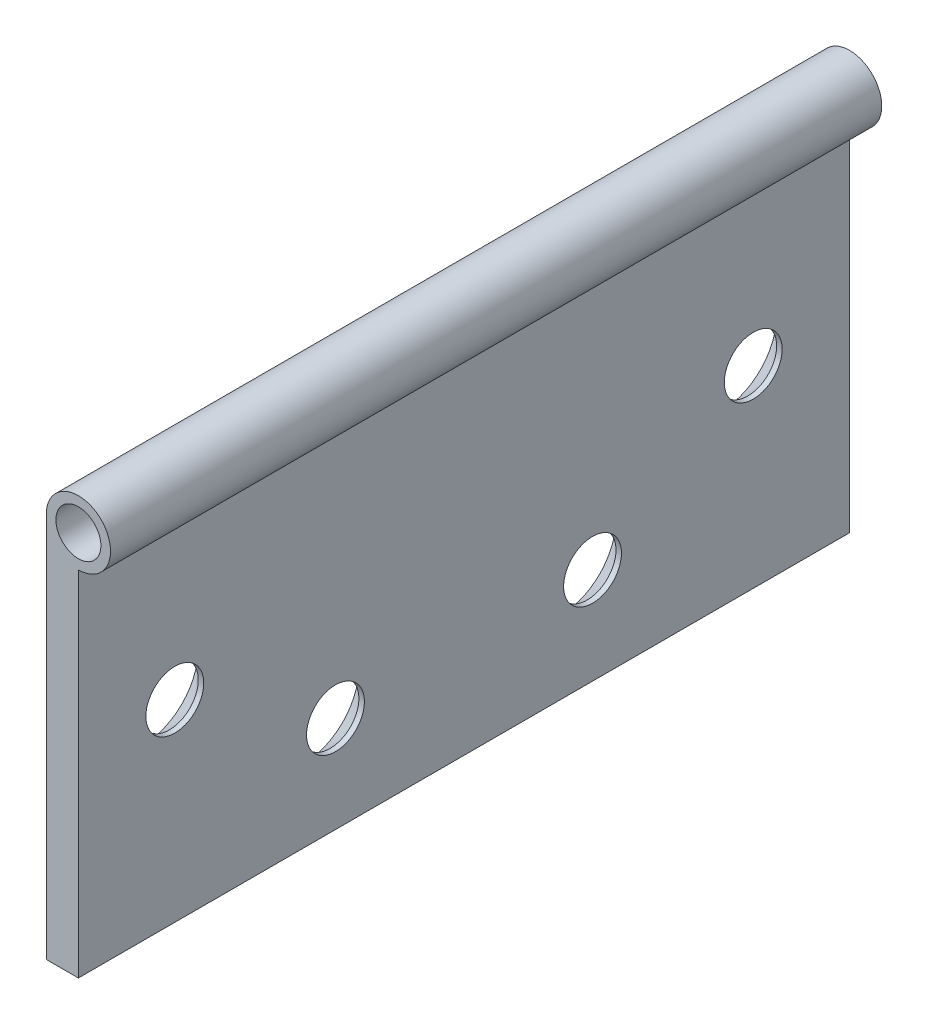
ISO-10303-21;
HEADER;
FILE_DESCRIPTION(('STEP AP214'),'2;1');
FILE_NAME('part.step','',(''),(''),'','','');
FILE_SCHEMA(('AUTOMOTIVE_DESIGN { 1 0 10303 214 1 1 1 1 }'));
ENDSEC;
DATA;
#1=APPLICATION_CONTEXT('core data for automotive mechanical design processes');
#2=APPLICATION_PROTOCOL_DEFINITION('international standard','automotive_design',2000,#1);
#3=PRODUCT_CONTEXT('',#1,'mechanical');
#4=PRODUCT('Part','Part','',(#3));
#5=PRODUCT_RELATED_PRODUCT_CATEGORY('part','',(#4));
#6=PRODUCT_DEFINITION_FORMATION('','',#4);
#7=PRODUCT_DEFINITION_CONTEXT('part definition',#1,'design');
#8=PRODUCT_DEFINITION('design','',#6,#7);
#9=PRODUCT_DEFINITION_SHAPE('','',#8);
#10=(LENGTH_UNIT() NAMED_UNIT(*) SI_UNIT(.MILLI.,.METRE.));
#11=(NAMED_UNIT(*) PLANE_ANGLE_UNIT() SI_UNIT($,.RADIAN.));
#12=(NAMED_UNIT(*) SI_UNIT($,.STERADIAN.) SOLID_ANGLE_UNIT());
#13=UNCERTAINTY_MEASURE_WITH_UNIT(LENGTH_MEASURE(1.E-05),#10,'distance_accuracy_value','');
#14=(GEOMETRIC_REPRESENTATION_CONTEXT(3) GLOBAL_UNCERTAINTY_ASSIGNED_CONTEXT((#13)) GLOBAL_UNIT_ASSIGNED_CONTEXT((#10,
#11,#12)) REPRESENTATION_CONTEXT('',''));
#15=CARTESIAN_POINT('',(0.,0.,0.));
#16=DIRECTION('',(0.,0.,1.));
#17=DIRECTION('',(1.,0.,0.));
#18=AXIS2_PLACEMENT_3D('',#15,#16,#17);
#19=CARTESIAN_POINT('',(5.,0.,60.));
#20=DIRECTION('',(-1.,0.,0.));
#21=DIRECTION('',(0.,0.,1.));
#22=AXIS2_PLACEMENT_3D('',#19,#20,#21);
#23=PLANE('',#22);
#24=CARTESIAN_POINT('',(5.,15.,-20.));
#25=DIRECTION('',(1.,0.,0.));
#26=DIRECTION('',(0.,0.,-1.));
#27=AXIS2_PLACEMENT_3D('',#24,#25,#26);
#28=CIRCLE('',#27,4.5);
#29=CARTESIAN_POINT('',(5.,15.,-24.5));
#30=VERTEX_POINT('',#29);
#31=EDGE_CURVE('E152',#30,#30,#28,.T.);
#32=ORIENTED_EDGE('',*,*,#31,.F.);
#33=EDGE_LOOP('',(#32));
#34=FACE_BOUND('',#33,.T.);
#35=CARTESIAN_POINT('',(5.,30.,-45.));
#36=DIRECTION('',(1.,0.,0.));
#37=DIRECTION('',(0.,0.,-1.));
#38=AXIS2_PLACEMENT_3D('',#35,#36,#37);
#39=CIRCLE('',#38,4.5);
#40=CARTESIAN_POINT('',(5.,30.,-49.5));
#41=VERTEX_POINT('',#40);
#42=EDGE_CURVE('E156',#41,#41,#39,.T.);
#43=ORIENTED_EDGE('',*,*,#42,.F.);
#44=EDGE_LOOP('',(#43));
#45=FACE_BOUND('',#44,.T.);
#46=CARTESIAN_POINT('',(5.,30.,45.));
#47=DIRECTION('',(-1.,0.,0.));
#48=DIRECTION('',(0.,0.,1.));
#49=AXIS2_PLACEMENT_3D('',#46,#47,#48);
#50=CIRCLE('',#49,4.5);
#51=CARTESIAN_POINT('',(5.,30.,49.5));
#52=VERTEX_POINT('',#51);
#53=EDGE_CURVE('E37',#52,#52,#50,.T.);
#54=ORIENTED_EDGE('',*,*,#53,.T.);
#55=EDGE_LOOP('',(#54));
#56=FACE_BOUND('',#55,.T.);
#57=CARTESIAN_POINT('',(5.,15.,20.));
#58=DIRECTION('',(-1.,0.,0.));
#59=DIRECTION('',(0.,0.,1.));
#60=AXIS2_PLACEMENT_3D('',#57,#58,#59);
#61=CIRCLE('',#60,4.5);
#62=CARTESIAN_POINT('',(5.,15.,24.5));
#63=VERTEX_POINT('',#62);
#64=EDGE_CURVE('E115',#63,#63,#61,.T.);
#65=ORIENTED_EDGE('',*,*,#64,.T.);
#66=EDGE_LOOP('',(#65));
#67=FACE_BOUND('',#66,.T.);
#68=DIRECTION('',(0.,0.,-1.));
#69=VECTOR('',#68,1.);
#70=CARTESIAN_POINT('',(5.,55.,60.));
#71=LINE('',#70,#69);
#72=CARTESIAN_POINT('',(5.,55.,60.));
#73=VERTEX_POINT('',#72);
#74=CARTESIAN_POINT('',(5.,55.,-60.));
#75=VERTEX_POINT('',#74);
#76=EDGE_CURVE('E50',#73,#75,#71,.T.);
#77=ORIENTED_EDGE('',*,*,#76,.F.);
#78=DIRECTION('',(0.,1.,0.));
#79=VECTOR('',#78,1.);
#80=CARTESIAN_POINT('',(5.,0.,60.));
#81=LINE('',#80,#79);
#82=CARTESIAN_POINT('',(5.,0.,60.));
#83=VERTEX_POINT('',#82);
#84=EDGE_CURVE('E105',#83,#73,#81,.T.);
#85=ORIENTED_EDGE('',*,*,#84,.F.);
#86=DIRECTION('',(0.,0.,-1.));
#87=VECTOR('',#86,1.);
#88=CARTESIAN_POINT('',(5.,0.,60.));
#89=LINE('',#88,#87);
#90=CARTESIAN_POINT('',(5.,0.,-60.));
#91=VERTEX_POINT('',#90);
#92=EDGE_CURVE('E59',#83,#91,#89,.T.);
#93=ORIENTED_EDGE('',*,*,#92,.T.);
#94=DIRECTION('',(0.,1.,0.));
#95=VECTOR('',#94,1.);
#96=CARTESIAN_POINT('',(5.,0.,-60.));
#97=LINE('',#96,#95);
#98=EDGE_CURVE('E100',#91,#75,#97,.T.);
#99=ORIENTED_EDGE('',*,*,#98,.T.);
#100=EDGE_LOOP('',(#77,#85,#93,#99));
#101=FACE_BOUND('',#100,.T.);
#102=ADVANCED_FACE('F34',(#34,#45,#56,#67,#101),#23,.F.);
#103=CARTESIAN_POINT('',(0.,0.,60.));
#104=DIRECTION('',(-1.,0.,0.));
#105=DIRECTION('',(0.,0.,1.));
#106=AXIS2_PLACEMENT_3D('',#103,#104,#105);
#107=PLANE('',#106);
#108=CARTESIAN_POINT('',(0.,15.,-20.));
#109=DIRECTION('',(1.,0.,0.));
#110=DIRECTION('',(0.,0.,-1.));
#111=AXIS2_PLACEMENT_3D('',#108,#109,#110);
#112=CIRCLE('',#111,8.65);
#113=CARTESIAN_POINT('',(0.,15.,-28.65));
#114=VERTEX_POINT('',#113);
#115=EDGE_CURVE('E179',#114,#114,#112,.T.);
#116=ORIENTED_EDGE('',*,*,#115,.T.);
#117=EDGE_LOOP('',(#116));
#118=FACE_BOUND('',#117,.T.);
#119=CARTESIAN_POINT('',(0.,30.,-45.));
#120=DIRECTION('',(1.,0.,0.));
#121=DIRECTION('',(0.,0.,-1.));
#122=AXIS2_PLACEMENT_3D('',#119,#120,#121);
#123=CIRCLE('',#122,8.65);
#124=CARTESIAN_POINT('',(0.,30.,-53.65));
#125=VERTEX_POINT('',#124);
#126=EDGE_CURVE('E172',#125,#125,#123,.T.);
#127=ORIENTED_EDGE('',*,*,#126,.T.);
#128=EDGE_LOOP('',(#127));
#129=FACE_BOUND('',#128,.T.);
#130=CARTESIAN_POINT('',(0.,30.,45.));
#131=DIRECTION('',(-1.,0.,0.));
#132=DIRECTION('',(0.,0.,1.));
#133=AXIS2_PLACEMENT_3D('',#130,#131,#132);
#134=CIRCLE('',#133,8.65);
#135=CARTESIAN_POINT('',(0.,30.,53.65));
#136=VERTEX_POINT('',#135);
#137=EDGE_CURVE('E162',#136,#136,#134,.T.);
#138=ORIENTED_EDGE('',*,*,#137,.F.);
#139=EDGE_LOOP('',(#138));
#140=FACE_BOUND('',#139,.T.);
#141=CARTESIAN_POINT('',(0.,15.,20.));
#142=DIRECTION('',(-1.,0.,0.));
#143=DIRECTION('',(0.,0.,1.));
#144=AXIS2_PLACEMENT_3D('',#141,#142,#143);
#145=CIRCLE('',#144,8.65);
#146=CARTESIAN_POINT('',(0.,15.,28.65));
#147=VERTEX_POINT('',#146);
#148=EDGE_CURVE('E124',#147,#147,#145,.T.);
#149=ORIENTED_EDGE('',*,*,#148,.F.);
#150=EDGE_LOOP('',(#149));
#151=FACE_BOUND('',#150,.T.);
#152=DIRECTION('',(0.,1.,0.));
#153=VECTOR('',#152,1.);
#154=CARTESIAN_POINT('',(0.,0.,-60.));
#155=LINE('',#154,#153);
#156=CARTESIAN_POINT('',(0.,0.,-60.));
#157=VERTEX_POINT('',#156);
#158=CARTESIAN_POINT('',(0.,60.,-60.));
#159=VERTEX_POINT('',#158);
#160=EDGE_CURVE('E99',#157,#159,#155,.T.);
#161=ORIENTED_EDGE('',*,*,#160,.F.);
#162=DIRECTION('',(0.,0.,-1.));
#163=VECTOR('',#162,1.);
#164=CARTESIAN_POINT('',(0.,0.,60.));
#165=LINE('',#164,#163);
#166=CARTESIAN_POINT('',(0.,0.,60.));
#167=VERTEX_POINT('',#166);
#168=EDGE_CURVE('E42',#167,#157,#165,.T.);
#169=ORIENTED_EDGE('',*,*,#168,.F.);
#170=DIRECTION('',(0.,1.,0.));
#171=VECTOR('',#170,1.);
#172=CARTESIAN_POINT('',(0.,0.,60.));
#173=LINE('',#172,#171);
#174=CARTESIAN_POINT('',(0.,60.,60.));
#175=VERTEX_POINT('',#174);
#176=EDGE_CURVE('E75',#167,#175,#173,.T.);
#177=ORIENTED_EDGE('',*,*,#176,.T.);
#178=DIRECTION('',(0.,0.,-1.));
#179=VECTOR('',#178,1.);
#180=CARTESIAN_POINT('',(0.,60.,60.));
#181=LINE('',#180,#179);
#182=EDGE_CURVE('E11',#175,#159,#181,.T.);
#183=ORIENTED_EDGE('',*,*,#182,.T.);
#184=EDGE_LOOP('',(#161,#169,#177,#183));
#185=FACE_BOUND('',#184,.T.);
#186=ADVANCED_FACE('F141',(#118,#129,#140,#151,#185),#107,.T.);
#187=CARTESIAN_POINT('',(5.,0.,60.));
#188=DIRECTION('',(0.,-1.,0.));
#189=DIRECTION('',(0.,0.,-1.));
#190=AXIS2_PLACEMENT_3D('',#187,#188,#189);
#191=PLANE('',#190);
#192=DIRECTION('',(-1.,0.,0.));
#193=VECTOR('',#192,1.);
#194=CARTESIAN_POINT('',(5.,0.,-60.));
#195=LINE('',#194,#193);
#196=EDGE_CURVE('E107',#91,#157,#195,.T.);
#197=ORIENTED_EDGE('',*,*,#196,.F.);
#198=ORIENTED_EDGE('',*,*,#92,.F.);
#199=DIRECTION('',(-1.,0.,0.));
#200=VECTOR('',#199,1.);
#201=CARTESIAN_POINT('',(5.,0.,60.));
#202=LINE('',#201,#200);
#203=EDGE_CURVE('E109',#83,#167,#202,.T.);
#204=ORIENTED_EDGE('',*,*,#203,.T.);
#205=ORIENTED_EDGE('',*,*,#168,.T.);
#206=EDGE_LOOP('',(#197,#198,#204,#205));
#207=FACE_BOUND('',#206,.T.);
#208=ADVANCED_FACE('F142',(#207),#191,.T.);
#209=CARTESIAN_POINT('',(0.,0.,60.));
#210=DIRECTION('',(0.,0.,-1.));
#211=DIRECTION('',(-1.,0.,0.));
#212=AXIS2_PLACEMENT_3D('',#209,#210,#211);
#213=PLANE('',#212);
#214=CARTESIAN_POINT('',(5.,60.,60.));
#215=DIRECTION('',(0.,0.,1.));
#216=DIRECTION('',(1.,0.,0.));
#217=AXIS2_PLACEMENT_3D('',#214,#215,#216);
#218=CIRCLE('',#217,3.5);
#219=CARTESIAN_POINT('',(8.5,60.,60.));
#220=VERTEX_POINT('',#219);
#221=EDGE_CURVE('E117',#220,#220,#218,.T.);
#222=ORIENTED_EDGE('',*,*,#221,.F.);
#223=EDGE_LOOP('',(#222));
#224=FACE_BOUND('',#223,.T.);
#225=ORIENTED_EDGE('',*,*,#84,.T.);
#226=CARTESIAN_POINT('',(5.,60.,60.));
#227=DIRECTION('',(0.,0.,1.));
#228=DIRECTION('',(1.,0.,0.));
#229=AXIS2_PLACEMENT_3D('',#226,#227,#228);
#230=CIRCLE('',#229,5.);
#231=CARTESIAN_POINT('',(10.,60.,60.));
#232=VERTEX_POINT('',#231);
#233=EDGE_CURVE('E133',#73,#232,#230,.T.);
#234=ORIENTED_EDGE('',*,*,#233,.T.);
#235=EDGE_CURVE('E93',#232,#175,#230,.T.);
#236=ORIENTED_EDGE('',*,*,#235,.T.);
#237=ORIENTED_EDGE('',*,*,#176,.F.);
#238=ORIENTED_EDGE('',*,*,#203,.F.);
#239=EDGE_LOOP('',(#225,#234,#236,#237,#238));
#240=FACE_BOUND('',#239,.T.);
#241=ADVANCED_FACE('F139',(#224,#240),#213,.F.);
#242=CARTESIAN_POINT('',(0.,0.,-60.));
#243=DIRECTION('',(0.,0.,-1.));
#244=DIRECTION('',(-1.,0.,0.));
#245=AXIS2_PLACEMENT_3D('',#242,#243,#244);
#246=PLANE('',#245);
#247=CARTESIAN_POINT('',(5.,60.,-60.));
#248=DIRECTION('',(0.,0.,1.));
#249=DIRECTION('',(1.,0.,0.));
#250=AXIS2_PLACEMENT_3D('',#247,#248,#249);
#251=CIRCLE('',#250,3.5);
#252=CARTESIAN_POINT('',(8.5,60.,-60.));
#253=VERTEX_POINT('',#252);
#254=EDGE_CURVE('E122',#253,#253,#251,.T.);
#255=ORIENTED_EDGE('',*,*,#254,.T.);
#256=EDGE_LOOP('',(#255));
#257=FACE_BOUND('',#256,.T.);
#258=ORIENTED_EDGE('',*,*,#160,.T.);
#259=CARTESIAN_POINT('',(5.,60.,-60.));
#260=DIRECTION('',(0.,0.,1.));
#261=DIRECTION('',(1.,0.,0.));
#262=AXIS2_PLACEMENT_3D('',#259,#260,#261);
#263=CIRCLE('',#262,5.);
#264=CARTESIAN_POINT('',(10.,60.,-60.));
#265=VERTEX_POINT('',#264);
#266=EDGE_CURVE('E90',#265,#159,#263,.T.);
#267=ORIENTED_EDGE('',*,*,#266,.F.);
#268=EDGE_CURVE('E87',#75,#265,#263,.T.);
#269=ORIENTED_EDGE('',*,*,#268,.F.);
#270=ORIENTED_EDGE('',*,*,#98,.F.);
#271=ORIENTED_EDGE('',*,*,#196,.T.);
#272=EDGE_LOOP('',(#258,#267,#269,#270,#271));
#273=FACE_BOUND('',#272,.T.);
#274=ADVANCED_FACE('F96',(#257,#273),#246,.T.);
#275=CARTESIAN_POINT('',(5.,60.,60.));
#276=DIRECTION('',(0.,0.,-1.));
#277=DIRECTION('',(-1.,0.,0.));
#278=AXIS2_PLACEMENT_3D('',#275,#276,#277);
#279=CYLINDRICAL_SURFACE('',#278,5.);
#280=ORIENTED_EDGE('',*,*,#182,.F.);
#281=ORIENTED_EDGE('',*,*,#235,.F.);
#282=ORIENTED_EDGE('',*,*,#233,.F.);
#283=ORIENTED_EDGE('',*,*,#76,.T.);
#284=ORIENTED_EDGE('',*,*,#268,.T.);
#285=ORIENTED_EDGE('',*,*,#266,.T.);
#286=EDGE_LOOP('',(#280,#281,#282,#283,#284,#285));
#287=FACE_BOUND('',#286,.T.);
#288=ADVANCED_FACE('F89',(#287),#279,.T.);
#289=CARTESIAN_POINT('',(5.,60.,-60.));
#290=DIRECTION('',(0.,0.,1.));
#291=DIRECTION('',(1.,0.,0.));
#292=AXIS2_PLACEMENT_3D('',#289,#290,#291);
#293=CYLINDRICAL_SURFACE('',#292,3.5);
#294=ORIENTED_EDGE('',*,*,#254,.F.);
#295=EDGE_LOOP('',(#294));
#296=FACE_BOUND('',#295,.T.);
#297=ORIENTED_EDGE('',*,*,#221,.T.);
#298=EDGE_LOOP('',(#297));
#299=FACE_BOUND('',#298,.T.);
#300=ADVANCED_FACE('F217',(#296,#299),#293,.F.);
#301=CARTESIAN_POINT('',(0.,15.,20.));
#302=DIRECTION('',(-1.,0.,0.));
#303=DIRECTION('',(0.,0.,1.));
#304=AXIS2_PLACEMENT_3D('',#301,#302,#303);
#305=CYLINDRICAL_SURFACE('',#304,4.5);
#306=CARTESIAN_POINT('',(4.14999999999999,15.,20.));
#307=DIRECTION('',(-1.,0.,0.));
#308=DIRECTION('',(0.,0.,1.));
#309=AXIS2_PLACEMENT_3D('',#306,#307,#308);
#310=CIRCLE('',#309,4.49999999999999);
#311=CARTESIAN_POINT('',(4.14999999999999,15.,24.5));
#312=VERTEX_POINT('',#311);
#313=EDGE_CURVE('E118',#312,#312,#310,.T.);
#314=ORIENTED_EDGE('',*,*,#313,.T.);
#315=EDGE_LOOP('',(#314));
#316=FACE_BOUND('',#315,.T.);
#317=ORIENTED_EDGE('',*,*,#64,.F.);
#318=EDGE_LOOP('',(#317));
#319=FACE_BOUND('',#318,.T.);
#320=ADVANCED_FACE('F213',(#316,#319),#305,.F.);
#321=CARTESIAN_POINT('',(0.,15.,20.));
#322=DIRECTION('',(-1.,0.,0.));
#323=DIRECTION('',(0.,0.,1.));
#324=AXIS2_PLACEMENT_3D('',#321,#322,#323);
#325=CONICAL_SURFACE('',#324,8.65,0.785398163397451);
#326=ORIENTED_EDGE('',*,*,#313,.F.);
#327=EDGE_LOOP('',(#326));
#328=FACE_BOUND('',#327,.T.);
#329=ORIENTED_EDGE('',*,*,#148,.T.);
#330=EDGE_LOOP('',(#329));
#331=FACE_BOUND('',#330,.T.);
#332=ADVANCED_FACE('F210',(#328,#331),#325,.F.);
#333=CARTESIAN_POINT('',(0.,30.,45.));
#334=DIRECTION('',(-1.,0.,0.));
#335=DIRECTION('',(0.,0.,1.));
#336=AXIS2_PLACEMENT_3D('',#333,#334,#335);
#337=CYLINDRICAL_SURFACE('',#336,4.5);
#338=CARTESIAN_POINT('',(4.14999999999999,30.,45.));
#339=DIRECTION('',(-1.,0.,0.));
#340=DIRECTION('',(0.,0.,1.));
#341=AXIS2_PLACEMENT_3D('',#338,#339,#340);
#342=CIRCLE('',#341,4.49999999999999);
#343=CARTESIAN_POINT('',(4.14999999999999,30.,49.5));
#344=VERTEX_POINT('',#343);
#345=EDGE_CURVE('E160',#344,#344,#342,.T.);
#346=ORIENTED_EDGE('',*,*,#345,.T.);
#347=EDGE_LOOP('',(#346));
#348=FACE_BOUND('',#347,.T.);
#349=ORIENTED_EDGE('',*,*,#53,.F.);
#350=EDGE_LOOP('',(#349));
#351=FACE_BOUND('',#350,.T.);
#352=ADVANCED_FACE('F206',(#348,#351),#337,.F.);
#353=CARTESIAN_POINT('',(0.,30.,45.));
#354=DIRECTION('',(-1.,0.,0.));
#355=DIRECTION('',(0.,0.,1.));
#356=AXIS2_PLACEMENT_3D('',#353,#354,#355);
#357=CONICAL_SURFACE('',#356,8.65,0.785398163397451);
#358=ORIENTED_EDGE('',*,*,#345,.F.);
#359=EDGE_LOOP('',(#358));
#360=FACE_BOUND('',#359,.T.);
#361=ORIENTED_EDGE('',*,*,#137,.T.);
#362=EDGE_LOOP('',(#361));
#363=FACE_BOUND('',#362,.T.);
#364=ADVANCED_FACE('F202',(#360,#363),#357,.F.);
#365=CARTESIAN_POINT('',(0.,30.,-45.));
#366=DIRECTION('',(-1.,0.,0.));
#367=DIRECTION('',(0.,0.,-1.));
#368=AXIS2_PLACEMENT_3D('',#365,#366,#367);
#369=CYLINDRICAL_SURFACE('',#368,4.5);
#370=CARTESIAN_POINT('',(4.14999999999999,30.,-45.));
#371=DIRECTION('',(1.,0.,0.));
#372=DIRECTION('',(0.,0.,-1.));
#373=AXIS2_PLACEMENT_3D('',#370,#371,#372);
#374=CIRCLE('',#373,4.49999999999999);
#375=CARTESIAN_POINT('',(4.14999999999999,30.,-49.5));
#376=VERTEX_POINT('',#375);
#377=EDGE_CURVE('E166',#376,#376,#374,.T.);
#378=ORIENTED_EDGE('',*,*,#377,.F.);
#379=EDGE_LOOP('',(#378));
#380=FACE_BOUND('',#379,.T.);
#381=ORIENTED_EDGE('',*,*,#42,.T.);
#382=EDGE_LOOP('',(#381));
#383=FACE_BOUND('',#382,.T.);
#384=ADVANCED_FACE('F198',(#380,#383),#369,.F.);
#385=CARTESIAN_POINT('',(0.,30.,-45.));
#386=DIRECTION('',(-1.,0.,0.));
#387=DIRECTION('',(0.,0.,-1.));
#388=AXIS2_PLACEMENT_3D('',#385,#386,#387);
#389=CONICAL_SURFACE('',#388,8.65,0.785398163397451);
#390=ORIENTED_EDGE('',*,*,#377,.T.);
#391=EDGE_LOOP('',(#390));
#392=FACE_BOUND('',#391,.T.);
#393=ORIENTED_EDGE('',*,*,#126,.F.);
#394=EDGE_LOOP('',(#393));
#395=FACE_BOUND('',#394,.T.);
#396=ADVANCED_FACE('F192',(#392,#395),#389,.F.);
#397=CARTESIAN_POINT('',(0.,15.,-20.));
#398=DIRECTION('',(-1.,0.,0.));
#399=DIRECTION('',(0.,0.,-1.));
#400=AXIS2_PLACEMENT_3D('',#397,#398,#399);
#401=CYLINDRICAL_SURFACE('',#400,4.5);
#402=CARTESIAN_POINT('',(4.14999999999999,15.,-20.));
#403=DIRECTION('',(1.,0.,0.));
#404=DIRECTION('',(0.,0.,-1.));
#405=AXIS2_PLACEMENT_3D('',#402,#403,#404);
#406=CIRCLE('',#405,4.49999999999999);
#407=CARTESIAN_POINT('',(4.14999999999999,15.,-24.5));
#408=VERTEX_POINT('',#407);
#409=EDGE_CURVE('E175',#408,#408,#406,.T.);
#410=ORIENTED_EDGE('',*,*,#409,.F.);
#411=EDGE_LOOP('',(#410));
#412=FACE_BOUND('',#411,.T.);
#413=ORIENTED_EDGE('',*,*,#31,.T.);
#414=EDGE_LOOP('',(#413));
#415=FACE_BOUND('',#414,.T.);
#416=ADVANCED_FACE('F186',(#412,#415),#401,.F.);
#417=CARTESIAN_POINT('',(0.,15.,-20.));
#418=DIRECTION('',(-1.,0.,0.));
#419=DIRECTION('',(0.,0.,-1.));
#420=AXIS2_PLACEMENT_3D('',#417,#418,#419);
#421=CONICAL_SURFACE('',#420,8.65,0.785398163397451);
#422=ORIENTED_EDGE('',*,*,#409,.T.);
#423=EDGE_LOOP('',(#422));
#424=FACE_BOUND('',#423,.T.);
#425=ORIENTED_EDGE('',*,*,#115,.F.);
#426=EDGE_LOOP('',(#425));
#427=FACE_BOUND('',#426,.T.);
#428=ADVANCED_FACE('F184',(#424,#427),#421,.F.);
#429=CLOSED_SHELL('',(#102,#186,#208,#241,#274,#288,#300,#320,#332,#352,#364,#384,#396,#416,#428));
#430=MANIFOLD_SOLID_BREP('B2',#429);
#431=ADVANCED_BREP_SHAPE_REPRESENTATION('',(#18,#430),#14);
#432=SHAPE_DEFINITION_REPRESENTATION(#9,#431);
ENDSEC;
END-ISO-10303-21;
